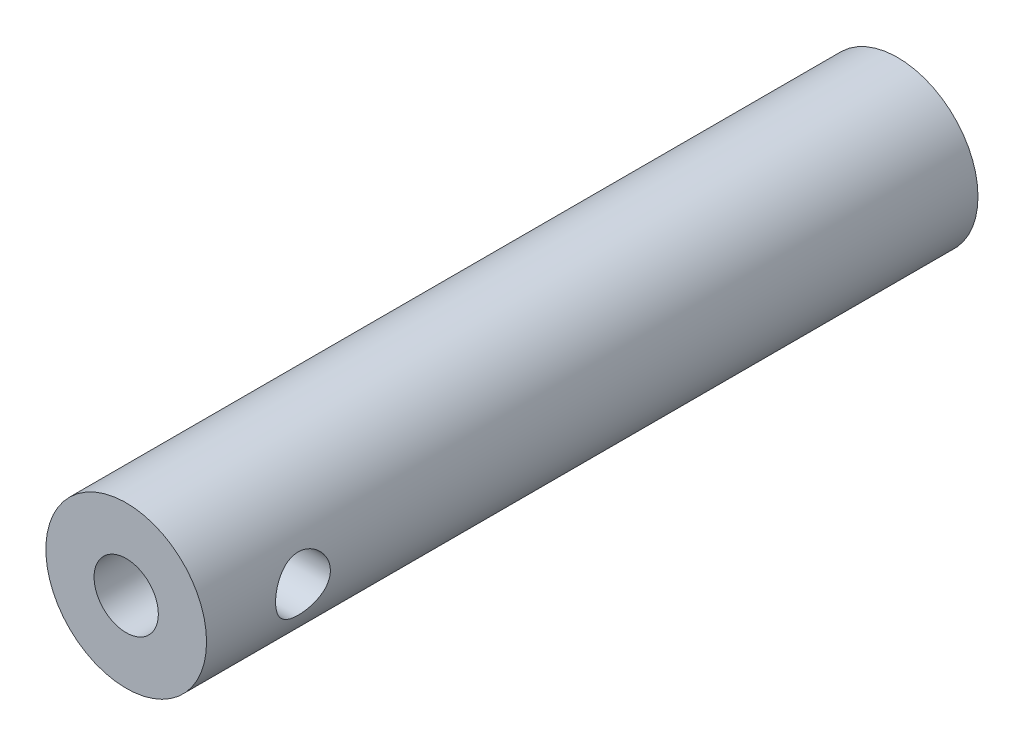
ISO-10303-21;
HEADER;
FILE_DESCRIPTION(('STEP AP214'),'2;1');
FILE_NAME('part.step','',(''),(''),'','','');
FILE_SCHEMA(('AUTOMOTIVE_DESIGN { 1 0 10303 214 1 1 1 1 }'));
ENDSEC;
DATA;
#1=APPLICATION_CONTEXT('core data for automotive mechanical design processes');
#2=APPLICATION_PROTOCOL_DEFINITION('international standard','automotive_design',2000,#1);
#3=PRODUCT_CONTEXT('',#1,'mechanical');
#4=PRODUCT('Part','Part','',(#3));
#5=PRODUCT_RELATED_PRODUCT_CATEGORY('part','',(#4));
#6=PRODUCT_DEFINITION_FORMATION('','',#4);
#7=PRODUCT_DEFINITION_CONTEXT('part definition',#1,'design');
#8=PRODUCT_DEFINITION('design','',#6,#7);
#9=PRODUCT_DEFINITION_SHAPE('','',#8);
#10=(LENGTH_UNIT() NAMED_UNIT(*) SI_UNIT(.MILLI.,.METRE.));
#11=(NAMED_UNIT(*) PLANE_ANGLE_UNIT() SI_UNIT($,.RADIAN.));
#12=(NAMED_UNIT(*) SI_UNIT($,.STERADIAN.) SOLID_ANGLE_UNIT());
#13=UNCERTAINTY_MEASURE_WITH_UNIT(LENGTH_MEASURE(1.E-05),#10,'distance_accuracy_value','');
#14=(GEOMETRIC_REPRESENTATION_CONTEXT(3) GLOBAL_UNCERTAINTY_ASSIGNED_CONTEXT((#13)) GLOBAL_UNIT_ASSIGNED_CONTEXT((#10,
#11,#12)) REPRESENTATION_CONTEXT('',''));
#15=CARTESIAN_POINT('',(0.,0.,0.));
#16=DIRECTION('',(0.,0.,1.));
#17=DIRECTION('',(1.,0.,0.));
#18=AXIS2_PLACEMENT_3D('',#15,#16,#17);
#19=CARTESIAN_POINT('',(0.,0.,-38.1));
#20=DIRECTION('',(0.,0.,1.));
#21=DIRECTION('',(1.,0.,0.));
#22=AXIS2_PLACEMENT_3D('',#19,#20,#21);
#23=CYLINDRICAL_SURFACE('',#22,3.96875);
#24=CARTESIAN_POINT('',(3.96875,0.,-6.11505));
#25=CARTESIAN_POINT('',(3.96875045747478,0.0737051339478816,-6.11505068485613));
#26=CARTESIAN_POINT('',(3.96667803527039,0.147405511676305,-6.1090058424297));
#27=CARTESIAN_POINT('',(3.95861534545674,0.292629805246551,-6.08506420723151));
#28=CARTESIAN_POINT('',(3.95262484522527,0.364153591596968,-6.06716671074895));
#29=CARTESIAN_POINT('',(3.93737558298542,0.50291012503076,-6.02020846267176));
#30=CARTESIAN_POINT('',(3.92812243421334,0.570150009250865,-5.99116687644046));
#31=CARTESIAN_POINT('',(3.90728835506987,0.698803896979316,-5.92283333183748));
#32=CARTESIAN_POINT('',(3.89570693376919,0.760216667781469,-5.88353921114016));
#33=CARTESIAN_POINT('',(3.87096484416059,0.877684314660364,-5.79433141502208));
#34=CARTESIAN_POINT('',(3.85776511764604,0.933500581261856,-5.74411444450988));
#35=CARTESIAN_POINT('',(3.83148494132716,1.0361033848314,-5.63513101593897));
#36=CARTESIAN_POINT('',(3.81840452008693,1.08288781079782,-5.57636256476803));
#37=CARTESIAN_POINT('',(3.79341009143774,1.16748696299639,-5.44976514434442));
#38=CARTESIAN_POINT('',(3.78154343565626,1.20498695329887,-5.38171559532273));
#39=CARTESIAN_POINT('',(3.76091637483004,1.26790735509728,-5.23980606548761));
#40=CARTESIAN_POINT('',(3.75215497286094,1.29333164432266,-5.16594795880073));
#41=CARTESIAN_POINT('',(3.73914275291971,1.33047567363132,-5.01723794087594));
#42=CARTESIAN_POINT('',(3.73474475087203,1.34264407001083,-4.94251136230156));
#43=CARTESIAN_POINT('',(3.730522659473,1.35433363468137,-4.79195766403706));
#44=CARTESIAN_POINT('',(3.73069708000199,1.3538589232696,-4.71613091093715));
#45=CARTESIAN_POINT('',(3.73547149545954,1.34062317260652,-4.5694009173888));
#46=CARTESIAN_POINT('',(3.73985843304648,1.32845360349352,-4.49843617423468));
#47=CARTESIAN_POINT('',(3.75221402128586,1.29314068265807,-4.3596234916576));
#48=CARTESIAN_POINT('',(3.76018311903626,1.26999596108083,-4.29177594246452));
#49=CARTESIAN_POINT('',(3.77895276401654,1.21301359545887,-4.15980381677857));
#50=CARTESIAN_POINT('',(3.78979819409043,1.17900452991985,-4.09575991644274));
#51=CARTESIAN_POINT('',(3.81308035238805,1.10137790636703,-3.97410367887927));
#52=CARTESIAN_POINT('',(3.8255175562621,1.05775747348275,-3.9164932737694));
#53=CARTESIAN_POINT('',(3.85141387704714,0.959328738817286,-3.80602383024678));
#54=CARTESIAN_POINT('',(3.86489166808016,0.904038763371462,-3.75359743509626));
#55=CARTESIAN_POINT('',(3.89075685207344,0.785287220844138,-3.65864518907687));
#56=CARTESIAN_POINT('',(3.90314413067266,0.721824798440255,-3.61612037581041));
#57=CARTESIAN_POINT('',(3.92560825928641,0.587580661055491,-3.54180886711841));
#58=CARTESIAN_POINT('',(3.93565876235711,0.516727416617127,-3.51014287494629));
#59=CARTESIAN_POINT('',(3.95212507247959,0.370274519037819,-3.45931538601643));
#60=CARTESIAN_POINT('',(3.95854220175077,0.294676603667482,-3.44014934002284));
#61=CARTESIAN_POINT('',(3.9667973795451,0.144539311451535,-3.41564336544558));
#62=CARTESIAN_POINT('',(3.96882878469297,0.0701058068216493,-3.40971918772455));
#63=CARTESIAN_POINT('',(3.96866655240617,-0.0787095652689527,-3.41019449459162));
#64=CARTESIAN_POINT('',(3.96647366492502,-0.153091439550578,-3.41659179170491));
#65=CARTESIAN_POINT('',(3.95823696682431,-0.297321982953645,-3.4410689520164));
#66=CARTESIAN_POINT('',(3.9523127979312,-0.367239720837896,-3.45878609552325));
#67=CARTESIAN_POINT('',(3.93732926007716,-0.503078869191837,-3.50494243069835));
#68=CARTESIAN_POINT('',(3.92826948823515,-0.56899976484356,-3.53338300021873));
#69=CARTESIAN_POINT('',(3.9076266042717,-0.696955143643783,-3.60102545604744));
#70=CARTESIAN_POINT('',(3.89598209168831,-0.758837095082204,-3.64049659716698));
#71=CARTESIAN_POINT('',(3.871485016687,-0.875286821355508,-3.72876570129432));
#72=CARTESIAN_POINT('',(3.85863207142213,-0.929852264853527,-3.7775666251913));
#73=CARTESIAN_POINT('',(3.83238914204796,-1.03282584197076,-3.88585539303935));
#74=CARTESIAN_POINT('',(3.81900271942795,-1.08081720833607,-3.94574138826951));
#75=CARTESIAN_POINT('',(3.79382538097582,-1.16612617414503,-4.07300118157744));
#76=CARTESIAN_POINT('',(3.78203449616475,-1.20344356607703,-4.14037512519229));
#77=CARTESIAN_POINT('',(3.76149016794005,-1.26620051312512,-4.28080235884926));
#78=CARTESIAN_POINT('',(3.75273316141343,-1.29165401391134,-4.35384886247185));
#79=CARTESIAN_POINT('',(3.73939711980489,-1.32977500314282,-4.50356149978459));
#80=CARTESIAN_POINT('',(3.7348160885994,-1.3424486007124,-4.58022588566892));
#81=CARTESIAN_POINT('',(3.73058448240023,-1.35416054651564,-4.73057297707645));
#82=CARTESIAN_POINT('',(3.7306826339154,-1.35389378180572,-4.80419505556007));
#83=CARTESIAN_POINT('',(3.73517310309199,-1.34145487176832,-4.95028619810771));
#84=CARTESIAN_POINT('',(3.73956514253156,-1.32928349779824,-5.02275533656713));
#85=CARTESIAN_POINT('',(3.75195737425668,-1.29388196598856,-5.1629799515));
#86=CARTESIAN_POINT('',(3.75988074229898,-1.27088671377747,-5.23080206276438));
#87=CARTESIAN_POINT('',(3.77841147465859,-1.21468298004691,-5.36167595033069));
#88=CARTESIAN_POINT('',(3.789019451151,-1.18147216868626,-5.42472663433163));
#89=CARTESIAN_POINT('',(3.81232234392,-1.10402820062801,-5.54736160350713));
#90=CARTESIAN_POINT('',(3.82508996946169,-1.05936431435787,-5.6066599686334));
#91=CARTESIAN_POINT('',(3.85097912351762,-0.960999397422231,-5.71714421292067));
#92=CARTESIAN_POINT('',(3.86410075328434,-0.907295757689312,-5.76832774165949));
#93=CARTESIAN_POINT('',(3.88987228185717,-0.789705675793399,-5.86327173234995));
#94=CARTESIAN_POINT('',(3.90248010469333,-0.725489504159245,-5.90663673110044));
#95=CARTESIAN_POINT('',(3.92520886379597,-0.590258065427058,-5.98191448360126));
#96=CARTESIAN_POINT('',(3.93533030228985,-0.519244175441224,-6.01382955073606));
#97=CARTESIAN_POINT('',(3.95168277632428,-0.374588004386666,-6.06433230506249));
#98=CARTESIAN_POINT('',(3.95802056621929,-0.301086713354613,-6.08328814104064));
#99=CARTESIAN_POINT('',(3.96655330412958,-0.151721445080766,-6.10864470103151));
#100=CARTESIAN_POINT('',(3.9687495291615,-0.075858203462955,-6.1150492951379));
#101=CARTESIAN_POINT('',(3.96875,0.,-6.11505));
#102=B_SPLINE_CURVE_WITH_KNOTS('',3,(#24,#25,#26,#27,#28,#29,#30,#31,#32,#33,#34,#35,#36,#37,
#38,#39,#40,#41,#42,#43,#44,#45,#46,#47,#48,#49,#50,#51,#52,#53,#54,#55,#56,#57,#58,#59,#60,#61,
#62,#63,#64,#65,#66,#67,#68,#69,#70,#71,#72,#73,#74,#75,#76,#77,#78,#79,#80,#81,#82,#83,#84,#85,
#86,#87,#88,#89,#90,#91,#92,#93,#94,#95,#96,#97,#98,#99,#100,#101),.UNSPECIFIED.,.T.,.F.,(4,2,2,
2,2,2,2,2,2,2,2,2,2,2,2,2,2,2,2,2,2,2,2,2,2,2,2,2,2,2,2,2,2,2,2,2,2,2,4),(0.,0.220836131370243,
0.441685375306182,0.662156497514729,0.882674156143887,1.11034945333971,1.33807790056239,
1.57270655280224,1.80725981044757,2.03360091429898,2.25986825612781,2.47526315731517,
2.69068494992241,2.90968918579874,3.12875901750066,3.35981926058727,3.59090370595536,
3.82447933290028,4.05796990472313,4.28093632100251,4.50386315691776,4.7199824088761,
4.93612943944768,5.158099144707,5.38013941130743,5.61274971592685,5.84536454239189,
6.07770524277707,6.30993482557213,6.52970841972019,6.74946777461379,6.96466341099944,
7.17990816303871,7.40489192545793,7.62994073472594,7.86431470215918,8.09864128914763,
8.32599858621082,8.55328576809562),.UNSPECIFIED.);
#103=CARTESIAN_POINT('',(3.96875,0.,-6.11505));
#104=VERTEX_POINT('',#103);
#105=EDGE_CURVE('E10',#104,#104,#102,.T.);
#106=ORIENTED_EDGE('',*,*,#105,.F.);
#107=EDGE_LOOP('',(#106));
#108=FACE_BOUND('',#107,.T.);
#109=CARTESIAN_POINT('',(0.,0.,-38.1));
#110=DIRECTION('',(0.,0.,1.));
#111=DIRECTION('',(1.,0.,0.));
#112=AXIS2_PLACEMENT_3D('',#109,#110,#111);
#113=CIRCLE('',#112,3.96875);
#114=CARTESIAN_POINT('',(3.96875,0.,-38.1));
#115=VERTEX_POINT('',#114);
#116=EDGE_CURVE('E46',#115,#115,#113,.T.);
#117=ORIENTED_EDGE('',*,*,#116,.T.);
#118=EDGE_LOOP('',(#117));
#119=FACE_BOUND('',#118,.T.);
#120=CARTESIAN_POINT('',(0.,0.,0.));
#121=DIRECTION('',(0.,0.,1.));
#122=DIRECTION('',(1.,0.,0.));
#123=AXIS2_PLACEMENT_3D('',#120,#121,#122);
#124=CIRCLE('',#123,3.96875);
#125=CARTESIAN_POINT('',(3.96875,0.,0.));
#126=VERTEX_POINT('',#125);
#127=EDGE_CURVE('E50',#126,#126,#124,.T.);
#128=ORIENTED_EDGE('',*,*,#127,.F.);
#129=EDGE_LOOP('',(#128));
#130=FACE_BOUND('',#129,.T.);
#131=ADVANCED_FACE('F36',(#108,#119,#130),#23,.T.);
#132=CARTESIAN_POINT('',(0.,0.,-38.1));
#133=DIRECTION('',(0.,0.,1.));
#134=DIRECTION('',(1.,0.,0.));
#135=AXIS2_PLACEMENT_3D('',#132,#133,#134);
#136=PLANE('',#135);
#137=ORIENTED_EDGE('',*,*,#116,.F.);
#138=EDGE_LOOP('',(#137));
#139=FACE_BOUND('',#138,.T.);
#140=ADVANCED_FACE('F84',(#139),#136,.F.);
#141=CARTESIAN_POINT('',(0.,0.,0.));
#142=DIRECTION('',(0.,0.,1.));
#143=DIRECTION('',(1.,0.,0.));
#144=AXIS2_PLACEMENT_3D('',#141,#142,#143);
#145=PLANE('',#144);
#146=CARTESIAN_POINT('',(0.,0.,0.));
#147=DIRECTION('',(0.,0.,1.));
#148=DIRECTION('',(1.,0.,0.));
#149=AXIS2_PLACEMENT_3D('',#146,#147,#148);
#150=CIRCLE('',#149,1.5875);
#151=CARTESIAN_POINT('',(1.5875,0.,0.));
#152=VERTEX_POINT('',#151);
#153=EDGE_CURVE('E57',#152,#152,#150,.T.);
#154=ORIENTED_EDGE('',*,*,#153,.F.);
#155=EDGE_LOOP('',(#154));
#156=FACE_BOUND('',#155,.T.);
#157=ORIENTED_EDGE('',*,*,#127,.T.);
#158=EDGE_LOOP('',(#157));
#159=FACE_BOUND('',#158,.T.);
#160=ADVANCED_FACE('F81',(#156,#159),#145,.T.);
#161=CARTESIAN_POINT('',(0.,0.,-15.24));
#162=DIRECTION('',(0.,0.,1.));
#163=DIRECTION('',(1.,0.,0.));
#164=AXIS2_PLACEMENT_3D('',#161,#162,#163);
#165=CYLINDRICAL_SURFACE('',#164,1.5875);
#166=CARTESIAN_POINT('',(1.5875,0.,-6.11505));
#167=CARTESIAN_POINT('',(1.58749457189573,0.0637557801867503,-6.11504446129416));
#168=CARTESIAN_POINT('',(1.58362139697617,0.127584395650741,-6.11050412042864));
#169=CARTESIAN_POINT('',(1.56846836652989,0.253145411756658,-6.09266892897747));
#170=CARTESIAN_POINT('',(1.55717532407759,0.314873874090991,-6.0793584916587));
#171=CARTESIAN_POINT('',(1.52822742870684,0.434068708639587,-6.04499742050144));
#172=CARTESIAN_POINT('',(1.51061393869737,0.491559928370429,-6.02399709374969));
#173=CARTESIAN_POINT('',(1.47024200809933,0.601656805584445,-5.97536003178491));
#174=CARTESIAN_POINT('',(1.44748280002634,0.654261732623576,-5.94772230656487));
#175=CARTESIAN_POINT('',(1.38874100891734,0.772937141682822,-5.87535427142569));
#176=CARTESIAN_POINT('',(1.35100789664627,0.836607853922579,-5.82810812189119));
#177=CARTESIAN_POINT('',(1.27123111800066,0.953500430390387,-5.72496448153975));
#178=CARTESIAN_POINT('',(1.22917578624323,1.00669282413287,-5.66904335901386));
#179=CARTESIAN_POINT('',(1.14303583440814,1.10357671713246,-5.54839013960786));
#180=CARTESIAN_POINT('',(1.09892745307308,1.14705700109056,-5.48350423666564));
#181=CARTESIAN_POINT('',(1.03520190716906,1.20388151857638,-5.38023329383009));
#182=CARTESIAN_POINT('',(1.01437889263476,1.22141508688899,-5.34484406719064));
#183=CARTESIAN_POINT('',(0.97434085674506,1.25358365447253,-5.2719192957033));
#184=CARTESIAN_POINT('',(0.955124524509195,1.26822103031857,-5.23438554349547));
#185=CARTESIAN_POINT('',(0.918209613113044,1.29522317610988,-5.15451640805583));
#186=CARTESIAN_POINT('',(0.900686705872858,1.30738272636792,-5.11202745864177));
#187=CARTESIAN_POINT('',(0.87047055011621,1.32769354699902,-5.02447811742207));
#188=CARTESIAN_POINT('',(0.857766883211675,1.33585347517471,-4.97942351763273));
#189=CARTESIAN_POINT('',(0.839095803976717,1.34766702526835,-4.88658071813296));
#190=CARTESIAN_POINT('',(0.833227820196495,1.35125420302449,-4.83876253915226));
#191=CARTESIAN_POINT('',(0.82997735550974,1.3532556487291,-4.74273949783911));
#192=CARTESIAN_POINT('',(0.832588246390665,1.35167395734488,-4.69453496692473));
#193=CARTESIAN_POINT('',(0.844631535697283,1.34416788950154,-4.60674986715905));
#194=CARTESIAN_POINT('',(0.852995748255259,1.33892177141299,-4.56694987639273));
#195=CARTESIAN_POINT('',(0.874133836852174,1.32521944234796,-4.48909638698332));
#196=CARTESIAN_POINT('',(0.886914874572262,1.31675801566171,-4.45104583921982));
#197=CARTESIAN_POINT('',(0.9274855907334,1.28876844533604,-4.34605973805525));
#198=CARTESIAN_POINT('',(0.958912397998085,1.26589130528161,-4.28144631472437));
#199=CARTESIAN_POINT('',(1.02626254780933,1.21195162034915,-4.15826085807221));
#200=CARTESIAN_POINT('',(1.06219947469982,1.18086401948294,-4.09970809478573));
#201=CARTESIAN_POINT('',(1.13794404435972,1.10824253197076,-3.98391018388281));
#202=CARTESIAN_POINT('',(1.17783768563982,1.06609214061857,-3.92710646626894));
#203=CARTESIAN_POINT('',(1.25595271750482,0.972851032947866,-3.8201768056385));
#204=CARTESIAN_POINT('',(1.29417611839899,0.92177145628382,-3.77004267758776));
#205=CARTESIAN_POINT('',(1.3638256050152,0.814798936340548,-3.68085030830167));
#206=CARTESIAN_POINT('',(1.3955472408571,0.759563476069496,-3.64124080445463));
#207=CARTESIAN_POINT('',(1.45353684429932,0.641630622116437,-3.56984019607523));
#208=CARTESIAN_POINT('',(1.47981011104227,0.578940573135136,-3.53804148906956));
#209=CARTESIAN_POINT('',(1.52102836417675,0.458234657896243,-3.48856310318264));
#210=CARTESIAN_POINT('',(1.53713874322712,0.4012282120101,-3.4694037143313));
#211=CARTESIAN_POINT('',(1.56307458708343,0.283828222525982,-3.43867754362521));
#212=CARTESIAN_POINT('',(1.57290447805755,0.223437096998829,-3.4271054145052));
#213=CARTESIAN_POINT('',(1.58551257057517,0.10064127314668,-3.41227747482633));
#214=CARTESIAN_POINT('',(1.58826154680637,0.0382293028369589,-3.40905613041063));
#215=CARTESIAN_POINT('',(1.58637411563069,-0.0863272322739651,-3.41127150510452));
#216=CARTESIAN_POINT('',(1.58173776120372,-0.148471798990225,-3.4167081621045));
#217=CARTESIAN_POINT('',(1.56602842636006,-0.266508166452849,-3.4352087557981));
#218=CARTESIAN_POINT('',(1.55539552159358,-0.322543284341902,-3.44775145567009));
#219=CARTESIAN_POINT('',(1.5287906099904,-0.431393655301288,-3.47933686302227));
#220=CARTESIAN_POINT('',(1.5128170310566,-0.484207954862731,-3.49838148446277));
#221=CARTESIAN_POINT('',(1.4704570062017,-0.602536432865164,-3.54934521476183));
#222=CARTESIAN_POINT('',(1.44237374245444,-0.666507984438017,-3.58343868596274));
#223=CARTESIAN_POINT('',(1.38066817130807,-0.786440557738498,-3.65978423552284));
#224=CARTESIAN_POINT('',(1.3470335719244,-0.842383275904159,-3.70205445571529));
#225=CARTESIAN_POINT('',(1.26734272197341,-0.959257213017078,-3.80503267548125));
#226=CARTESIAN_POINT('',(1.22030791992752,-1.01781348990302,-3.86769244516691));
#227=CARTESIAN_POINT('',(1.14912984559645,-1.09585867993603,-3.96859043743968));
#228=CARTESIAN_POINT('',(1.12528578583038,-1.120253276624,-4.0033962297127));
#229=CARTESIAN_POINT('',(1.07804785296253,-1.16577950578336,-4.07536031565273));
#230=CARTESIAN_POINT('',(1.05465376064159,-1.18691276429792,-4.11251742388128));
#231=CARTESIAN_POINT('',(1.00377566688065,-1.2304290558751,-4.19834512610342));
#232=CARTESIAN_POINT('',(0.976626010767772,-1.25193425867196,-4.24766633718603));
#233=CARTESIAN_POINT('',(0.926599160451215,-1.28939589800484,-4.3503994230734));
#234=CARTESIAN_POINT('',(0.903712415921724,-1.30536480857007,-4.40380176651655));
#235=CARTESIAN_POINT('',(0.870759536170488,-1.3274868309936,-4.49999549911353));
#236=CARTESIAN_POINT('',(0.858901824883158,-1.33512245367011,-4.54181161877498));
#237=CARTESIAN_POINT('',(0.841042998909305,-1.34644659774743,-4.62716384241014));
#238=CARTESIAN_POINT('',(0.835027910720244,-1.3501445387511,-4.67069558220638));
#239=CARTESIAN_POINT('',(0.829969110934598,-1.35326256291525,-4.75861701369336));
#240=CARTESIAN_POINT('',(0.830969108283163,-1.35265582461229,-4.80301036279137));
#241=CARTESIAN_POINT('',(0.839831747360803,-1.34716814873848,-4.89085807542695));
#242=CARTESIAN_POINT('',(0.847706003301847,-1.34227997754604,-4.93431072223854));
#243=CARTESIAN_POINT('',(0.872188820891875,-1.3265396687326,-5.03244805036279));
#244=CARTESIAN_POINT('',(0.890757461820557,-1.31430147319789,-5.08640107721784));
#245=CARTESIAN_POINT('',(0.933584642185811,-1.28423675126972,-5.19037362892035));
#246=CARTESIAN_POINT('',(0.95786292171645,-1.26639076326535,-5.24037868454949));
#247=CARTESIAN_POINT('',(1.02536785036487,-1.21308879327782,-5.36666479990229));
#248=CARTESIAN_POINT('',(1.07098926409805,-1.17358300592934,-5.43994898733271));
#249=CARTESIAN_POINT('',(1.16316381803901,-1.08233922935241,-5.57782723123639));
#250=CARTESIAN_POINT('',(1.20971821183877,-1.03058360911152,-5.64240854955755));
#251=CARTESIAN_POINT('',(1.30064022486284,-0.913311742023992,-5.76377219595243));
#252=CARTESIAN_POINT('',(1.34492583516401,-0.847488200483933,-5.8203234853153));
#253=CARTESIAN_POINT('',(1.42570981191693,-0.70306120089508,-5.92128721079273));
#254=CARTESIAN_POINT('',(1.46223512468554,-0.624503692447097,-5.96574180680473));
#255=CARTESIAN_POINT('',(1.51235490793656,-0.486094698795734,-6.02607486285915));
#256=CARTESIAN_POINT('',(1.52948819266802,-0.429484571342007,-6.04649691894416));
#257=CARTESIAN_POINT('',(1.55755334049984,-0.312674228089964,-6.07980399171062));
#258=CARTESIAN_POINT('',(1.56849974302432,-0.2524827998774,-6.09270668144797));
#259=CARTESIAN_POINT('',(1.5797583647557,-0.15979676432332,-6.10595689510771));
#260=CARTESIAN_POINT('',(1.58265328437852,-0.128012244606141,-6.10935861598948));
#261=CARTESIAN_POINT('',(1.58652572466248,-0.064158015928579,-6.11390686415062));
#262=CARTESIAN_POINT('',(1.58750273196052,-0.0320882329192734,-6.1150527876262));
#263=CARTESIAN_POINT('',(1.5875,0.,-6.11505));
#264=B_SPLINE_CURVE_WITH_KNOTS('',3,(#166,#167,#168,#169,#170,#171,#172,#173,#174,#175,#176,
#177,#178,#179,#180,#181,#182,#183,#184,#185,#186,#187,#188,#189,#190,#191,#192,#193,#194,#195,
#196,#197,#198,#199,#200,#201,#202,#203,#204,#205,#206,#207,#208,#209,#210,#211,#212,#213,#214,
#215,#216,#217,#218,#219,#220,#221,#222,#223,#224,#225,#226,#227,#228,#229,#230,#231,#232,#233,
#234,#235,#236,#237,#238,#239,#240,#241,#242,#243,#244,#245,#246,#247,#248,#249,#250,#251,#252,
#253,#254,#255,#256,#257,#258,#259,#260,#261,#262,#263),.UNSPECIFIED.,.T.,.F.,(4,2,2,2,2,2,2,2,
2,2,2,2,2,2,2,2,2,2,2,2,2,2,2,2,2,2,2,2,2,2,2,2,2,2,2,2,2,2,2,2,2,2,2,2,2,2,2,2,4),(0.,
0.191127280812568,0.382595163885923,0.572832215725789,0.763097660182834,1.0250902600286,
1.28780951651102,1.5557813608718,1.68959455477265,1.82329748384562,1.96555153751847,
2.10749628514801,2.25148088482203,2.39535295414659,2.51790517500865,2.64065704839828,
2.86559176230715,3.09122100774408,3.33408300270971,3.57664414843002,3.80083568048714,
4.02480812802,4.21080922748518,4.39667909783453,4.58331489525221,4.76994935381286,
4.94439673752034,5.1188955173674,5.35083772959922,5.58330058233509,5.87513354731764,
6.02121609267701,6.16722556700633,6.34762188912568,6.52760907085383,6.65952565976134,
6.79112596794788,6.92354696418981,7.05619212256149,7.23027425211087,7.40496732594984,
7.68829221433071,7.97202739493442,8.26274508509291,8.55243618457419,8.73942943003034,
8.9259813868678,9.02214985598575,9.11834406278514),.UNSPECIFIED.);
#265=CARTESIAN_POINT('',(1.5875,0.,-6.11505));
#266=VERTEX_POINT('',#265);
#267=EDGE_CURVE('E60',#266,#266,#264,.T.);
#268=ORIENTED_EDGE('',*,*,#267,.T.);
#269=EDGE_LOOP('',(#268));
#270=FACE_BOUND('',#269,.T.);
#271=CARTESIAN_POINT('',(0.,0.,-15.24));
#272=DIRECTION('',(0.,0.,1.));
#273=DIRECTION('',(1.,0.,0.));
#274=AXIS2_PLACEMENT_3D('',#271,#272,#273);
#275=CIRCLE('',#274,1.5875);
#276=CARTESIAN_POINT('',(1.5875,0.,-15.24));
#277=VERTEX_POINT('',#276);
#278=EDGE_CURVE('E55',#277,#277,#275,.T.);
#279=ORIENTED_EDGE('',*,*,#278,.F.);
#280=EDGE_LOOP('',(#279));
#281=FACE_BOUND('',#280,.T.);
#282=ORIENTED_EDGE('',*,*,#153,.T.);
#283=EDGE_LOOP('',(#282));
#284=FACE_BOUND('',#283,.T.);
#285=ADVANCED_FACE('F67',(#270,#281,#284),#165,.F.);
#286=CARTESIAN_POINT('',(0.,0.,-15.24));
#287=DIRECTION('',(0.,0.,1.));
#288=DIRECTION('',(1.,0.,0.));
#289=AXIS2_PLACEMENT_3D('',#286,#287,#288);
#290=PLANE('',#289);
#291=ORIENTED_EDGE('',*,*,#278,.T.);
#292=EDGE_LOOP('',(#291));
#293=FACE_BOUND('',#292,.T.);
#294=ADVANCED_FACE('F74',(#293),#290,.T.);
#295=CARTESIAN_POINT('',(3.96875,0.,-4.7625));
#296=DIRECTION('',(1.,0.,0.));
#297=DIRECTION('',(0.,0.,-1.));
#298=AXIS2_PLACEMENT_3D('',#295,#296,#297);
#299=CYLINDRICAL_SURFACE('',#298,1.35255);
#300=ORIENTED_EDGE('',*,*,#105,.T.);
#301=EDGE_LOOP('',(#300));
#302=FACE_BOUND('',#301,.T.);
#303=ORIENTED_EDGE('',*,*,#267,.F.);
#304=EDGE_LOOP('',(#303));
#305=FACE_BOUND('',#304,.T.);
#306=ADVANCED_FACE('F71',(#302,#305),#299,.F.);
#307=CLOSED_SHELL('',(#131,#140,#160,#285,#294,#306));
#308=MANIFOLD_SOLID_BREP('B2',#307);
#309=ADVANCED_BREP_SHAPE_REPRESENTATION('',(#18,#308),#14);
#310=SHAPE_DEFINITION_REPRESENTATION(#9,#309);
ENDSEC;
END-ISO-10303-21;
